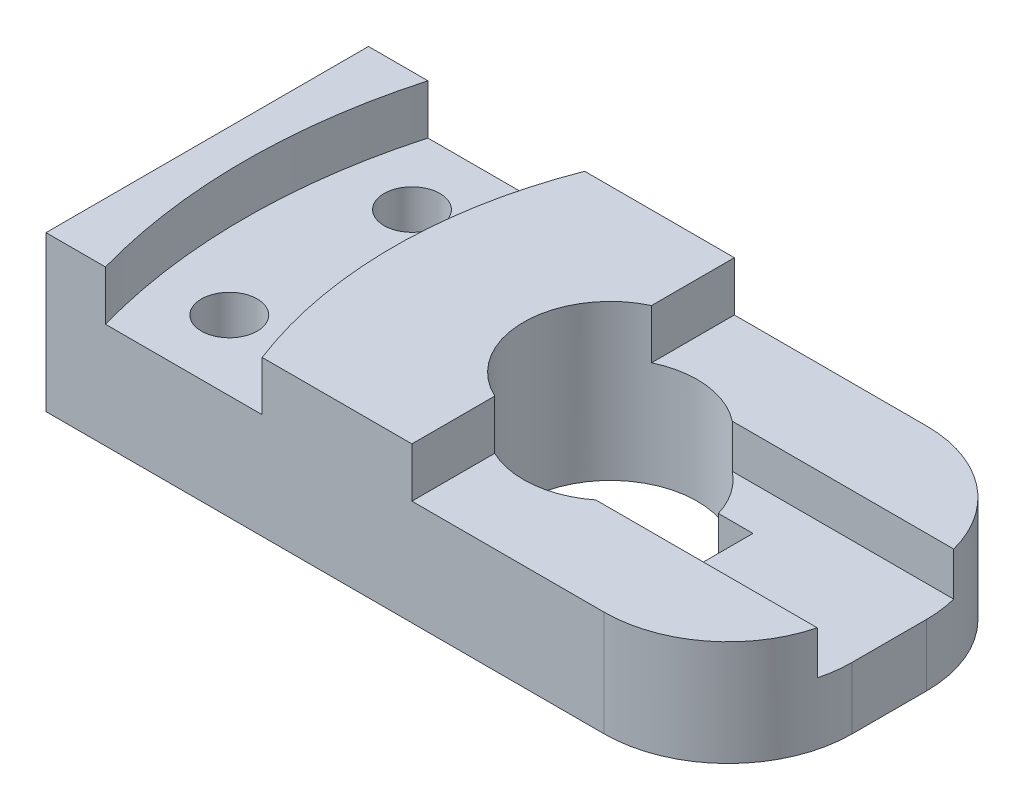
ISO-10303-21;
HEADER;
FILE_DESCRIPTION(('STEP AP214'),'2;1');
FILE_NAME('part.step','',(''),(''),'','','');
FILE_SCHEMA(('AUTOMOTIVE_DESIGN { 1 0 10303 214 1 1 1 1 }'));
ENDSEC;
DATA;
#1=APPLICATION_CONTEXT('core data for automotive mechanical design processes');
#2=APPLICATION_PROTOCOL_DEFINITION('international standard','automotive_design',2000,#1);
#3=PRODUCT_CONTEXT('',#1,'mechanical');
#4=PRODUCT('Part','Part','',(#3));
#5=PRODUCT_RELATED_PRODUCT_CATEGORY('part','',(#4));
#6=PRODUCT_DEFINITION_FORMATION('','',#4);
#7=PRODUCT_DEFINITION_CONTEXT('part definition',#1,'design');
#8=PRODUCT_DEFINITION('design','',#6,#7);
#9=PRODUCT_DEFINITION_SHAPE('','',#8);
#10=(LENGTH_UNIT() NAMED_UNIT(*) SI_UNIT(.MILLI.,.METRE.));
#11=(NAMED_UNIT(*) PLANE_ANGLE_UNIT() SI_UNIT($,.RADIAN.));
#12=(NAMED_UNIT(*) SI_UNIT($,.STERADIAN.) SOLID_ANGLE_UNIT());
#13=UNCERTAINTY_MEASURE_WITH_UNIT(LENGTH_MEASURE(1.E-05),#10,'distance_accuracy_value','');
#14=(GEOMETRIC_REPRESENTATION_CONTEXT(3) GLOBAL_UNCERTAINTY_ASSIGNED_CONTEXT((#13)) GLOBAL_UNIT_ASSIGNED_CONTEXT((#10,
#11,#12)) REPRESENTATION_CONTEXT('',''));
#15=CARTESIAN_POINT('',(0.,0.,0.));
#16=DIRECTION('',(0.,0.,1.));
#17=DIRECTION('',(1.,0.,0.));
#18=AXIS2_PLACEMENT_3D('',#15,#16,#17);
#19=CARTESIAN_POINT('',(0.,17.,-11.));
#20=DIRECTION('',(0.,0.,-1.));
#21=DIRECTION('',(-1.,0.,0.));
#22=AXIS2_PLACEMENT_3D('',#19,#20,#21);
#23=PLANE('',#22);
#24=DIRECTION('',(0.,-1.,0.));
#25=VECTOR('',#24,1.);
#26=CARTESIAN_POINT('',(73.6602540378444,17.,-11.));
#27=LINE('',#26,#25);
#28=CARTESIAN_POINT('',(73.6602540378444,17.,-11.));
#29=VERTEX_POINT('',#28);
#30=CARTESIAN_POINT('',(73.6602540378444,10.,-11.));
#31=VERTEX_POINT('',#30);
#32=EDGE_CURVE('E334',#29,#31,#27,.T.);
#33=ORIENTED_EDGE('',*,*,#32,.T.);
#34=DIRECTION('',(1.,0.,0.));
#35=VECTOR('',#34,1.);
#36=CARTESIAN_POINT('',(0.,10.,-11.));
#37=LINE('',#36,#35);
#38=CARTESIAN_POINT('',(109.364916731037,10.,-11.));
#39=VERTEX_POINT('',#38);
#40=EDGE_CURVE('E195',#31,#39,#37,.T.);
#41=ORIENTED_EDGE('',*,*,#40,.T.);
#42=DIRECTION('',(0.,-1.,0.));
#43=VECTOR('',#42,1.);
#44=CARTESIAN_POINT('',(109.364916731037,17.,-11.));
#45=LINE('',#44,#43);
#46=CARTESIAN_POINT('',(109.364916731037,17.,-11.));
#47=VERTEX_POINT('',#46);
#48=EDGE_CURVE('E11',#47,#39,#45,.T.);
#49=ORIENTED_EDGE('',*,*,#48,.F.);
#50=DIRECTION('',(1.,0.,0.));
#51=VECTOR('',#50,1.);
#52=CARTESIAN_POINT('',(0.,17.,-11.));
#53=LINE('',#52,#51);
#54=EDGE_CURVE('E318',#29,#47,#53,.T.);
#55=ORIENTED_EDGE('',*,*,#54,.F.);
#56=EDGE_LOOP('',(#33,#41,#49,#55));
#57=FACE_BOUND('',#56,.T.);
#58=ADVANCED_FACE('F39',(#57),#23,.F.);
#59=CARTESIAN_POINT('',(90.,17.,-6.));
#60=DIRECTION('',(0.,-1.,0.));
#61=DIRECTION('',(0.,0.,-1.));
#62=AXIS2_PLACEMENT_3D('',#59,#60,#61);
#63=CYLINDRICAL_SURFACE('',#62,20.);
#64=CARTESIAN_POINT('',(90.,0.,-6.));
#65=DIRECTION('',(0.,1.,0.));
#66=DIRECTION('',(0.,0.,1.));
#67=AXIS2_PLACEMENT_3D('',#64,#65,#66);
#68=CIRCLE('',#67,20.);
#69=CARTESIAN_POINT('',(110.,0.,-5.99999999999986));
#70=VERTEX_POINT('',#69);
#71=CARTESIAN_POINT('',(89.9999999999999,0.,-26.));
#72=VERTEX_POINT('',#71);
#73=EDGE_CURVE('E320',#70,#72,#68,.T.);
#74=ORIENTED_EDGE('',*,*,#73,.T.);
#75=DIRECTION('',(0.,-1.,0.));
#76=VECTOR('',#75,1.);
#77=CARTESIAN_POINT('',(89.9999999999999,17.,-26.));
#78=LINE('',#77,#76);
#79=CARTESIAN_POINT('',(89.9999999999999,17.,-26.));
#80=VERTEX_POINT('',#79);
#81=EDGE_CURVE('E46',#80,#72,#78,.T.);
#82=ORIENTED_EDGE('',*,*,#81,.F.);
#83=CARTESIAN_POINT('',(90.,17.,-6.));
#84=DIRECTION('',(0.,1.,0.));
#85=DIRECTION('',(0.,0.,1.));
#86=AXIS2_PLACEMENT_3D('',#83,#84,#85);
#87=CIRCLE('',#86,20.);
#88=EDGE_CURVE('E321',#47,#80,#87,.T.);
#89=ORIENTED_EDGE('',*,*,#88,.F.);
#90=ORIENTED_EDGE('',*,*,#48,.T.);
#91=CARTESIAN_POINT('',(90.,10.,-6.));
#92=DIRECTION('',(0.,1.,0.));
#93=DIRECTION('',(0.,0.,1.));
#94=AXIS2_PLACEMENT_3D('',#91,#92,#93);
#95=CIRCLE('',#94,20.);
#96=CARTESIAN_POINT('',(110.,10.,-5.99999999999986));
#97=VERTEX_POINT('',#96);
#98=EDGE_CURVE('E52',#97,#39,#95,.T.);
#99=ORIENTED_EDGE('',*,*,#98,.F.);
#100=DIRECTION('',(0.,-1.,0.));
#101=VECTOR('',#100,1.);
#102=CARTESIAN_POINT('',(110.,10.,-5.99999999999986));
#103=LINE('',#102,#101);
#104=EDGE_CURVE('E186',#97,#70,#103,.T.);
#105=ORIENTED_EDGE('',*,*,#104,.T.);
#106=EDGE_LOOP('',(#74,#82,#89,#90,#99,#105));
#107=FACE_BOUND('',#106,.T.);
#108=ADVANCED_FACE('F190',(#107),#63,.T.);
#109=CARTESIAN_POINT('',(0.,17.,-26.));
#110=DIRECTION('',(0.,0.,-1.));
#111=DIRECTION('',(-1.,0.,0.));
#112=AXIS2_PLACEMENT_3D('',#109,#110,#111);
#113=PLANE('',#112);
#114=DIRECTION('',(1.,0.,0.));
#115=VECTOR('',#114,1.);
#116=CARTESIAN_POINT('',(0.,0.,-26.));
#117=LINE('',#116,#115);
#118=CARTESIAN_POINT('',(0.,0.,-26.));
#119=VERTEX_POINT('',#118);
#120=EDGE_CURVE('E333',#119,#72,#117,.T.);
#121=ORIENTED_EDGE('',*,*,#120,.F.);
#122=DIRECTION('',(0.,-1.,0.));
#123=VECTOR('',#122,1.);
#124=CARTESIAN_POINT('',(0.,25.,-26.));
#125=LINE('',#124,#123);
#126=CARTESIAN_POINT('',(0.,25.,-26.));
#127=VERTEX_POINT('',#126);
#128=EDGE_CURVE('E235',#127,#119,#125,.T.);
#129=ORIENTED_EDGE('',*,*,#128,.F.);
#130=DIRECTION('',(1.,0.,0.));
#131=VECTOR('',#130,1.);
#132=CARTESIAN_POINT('',(0.,25.,-26.));
#133=LINE('',#132,#131);
#134=CARTESIAN_POINT('',(9.58787958281661,25.,-26.));
#135=VERTEX_POINT('',#134);
#136=EDGE_CURVE('E219',#127,#135,#133,.T.);
#137=ORIENTED_EDGE('',*,*,#136,.T.);
#138=DIRECTION('',(0.,-1.,0.));
#139=VECTOR('',#138,1.);
#140=CARTESIAN_POINT('',(9.58787958281661,25.,-26.));
#141=LINE('',#140,#139);
#142=CARTESIAN_POINT('',(9.58787958281661,17.,-26.));
#143=VERTEX_POINT('',#142);
#144=EDGE_CURVE('E234',#135,#143,#141,.T.);
#145=ORIENTED_EDGE('',*,*,#144,.T.);
#146=DIRECTION('',(1.,0.,0.));
#147=VECTOR('',#146,1.);
#148=CARTESIAN_POINT('',(0.,17.,-26.));
#149=LINE('',#148,#147);
#150=CARTESIAN_POINT('',(34.8583586736219,17.,-26.));
#151=VERTEX_POINT('',#150);
#152=EDGE_CURVE('E246',#143,#151,#149,.T.);
#153=ORIENTED_EDGE('',*,*,#152,.T.);
#154=DIRECTION('',(0.,-1.,0.));
#155=VECTOR('',#154,1.);
#156=CARTESIAN_POINT('',(34.8583586736219,25.,-26.));
#157=LINE('',#156,#155);
#158=CARTESIAN_POINT('',(34.8583586736219,25.,-26.));
#159=VERTEX_POINT('',#158);
#160=EDGE_CURVE('E310',#159,#151,#157,.T.);
#161=ORIENTED_EDGE('',*,*,#160,.F.);
#162=DIRECTION('',(1.,0.,0.));
#163=VECTOR('',#162,1.);
#164=CARTESIAN_POINT('',(0.,25.,-26.));
#165=LINE('',#164,#163);
#166=CARTESIAN_POINT('',(59.,25.,-26.));
#167=VERTEX_POINT('',#166);
#168=EDGE_CURVE('E289',#159,#167,#165,.T.);
#169=ORIENTED_EDGE('',*,*,#168,.T.);
#170=DIRECTION('',(0.,-1.,0.));
#171=VECTOR('',#170,1.);
#172=CARTESIAN_POINT('',(59.,25.,-26.));
#173=LINE('',#172,#171);
#174=CARTESIAN_POINT('',(59.,17.,-26.));
#175=VERTEX_POINT('',#174);
#176=EDGE_CURVE('E315',#167,#175,#173,.T.);
#177=ORIENTED_EDGE('',*,*,#176,.T.);
#178=DIRECTION('',(1.,0.,0.));
#179=VECTOR('',#178,1.);
#180=CARTESIAN_POINT('',(0.,17.,-26.));
#181=LINE('',#180,#179);
#182=EDGE_CURVE('E322',#175,#80,#181,.T.);
#183=ORIENTED_EDGE('',*,*,#182,.T.);
#184=ORIENTED_EDGE('',*,*,#81,.T.);
#185=EDGE_LOOP('',(#121,#129,#137,#145,#153,#161,#169,#177,#183,#184));
#186=FACE_BOUND('',#185,.T.);
#187=ADVANCED_FACE('F345',(#186),#113,.T.);
#188=CARTESIAN_POINT('',(65.,17.,0.));
#189=DIRECTION('',(0.,-1.,0.));
#190=DIRECTION('',(0.,0.,-1.));
#191=AXIS2_PLACEMENT_3D('',#188,#189,#190);
#192=CYLINDRICAL_SURFACE('',#191,14.);
#193=CARTESIAN_POINT('',(65.,0.,0.));
#194=DIRECTION('',(0.,1.,0.));
#195=DIRECTION('',(0.,0.,1.));
#196=AXIS2_PLACEMENT_3D('',#193,#194,#195);
#197=CIRCLE('',#196,14.);
#198=CARTESIAN_POINT('',(78.4164078649988,0.,-4.));
#199=VERTEX_POINT('',#198);
#200=CARTESIAN_POINT('',(78.4164078649988,0.,4.));
#201=VERTEX_POINT('',#200);
#202=EDGE_CURVE('E325',#199,#201,#197,.T.);
#203=ORIENTED_EDGE('',*,*,#202,.F.);
#204=DIRECTION('',(0.,-1.,0.));
#205=VECTOR('',#204,1.);
#206=CARTESIAN_POINT('',(78.4164078649988,10.,-4.));
#207=LINE('',#206,#205);
#208=CARTESIAN_POINT('',(78.4164078649988,10.,-4.));
#209=VERTEX_POINT('',#208);
#210=EDGE_CURVE('E208',#209,#199,#207,.T.);
#211=ORIENTED_EDGE('',*,*,#210,.F.);
#212=CARTESIAN_POINT('',(65.,10.,0.));
#213=DIRECTION('',(0.,1.,0.));
#214=DIRECTION('',(0.,0.,1.));
#215=AXIS2_PLACEMENT_3D('',#212,#213,#214);
#216=CIRCLE('',#215,14.);
#217=EDGE_CURVE('E389',#209,#31,#216,.T.);
#218=ORIENTED_EDGE('',*,*,#217,.T.);
#219=ORIENTED_EDGE('',*,*,#32,.F.);
#220=CARTESIAN_POINT('',(65.,17.,0.));
#221=DIRECTION('',(0.,1.,0.));
#222=DIRECTION('',(0.,0.,1.));
#223=AXIS2_PLACEMENT_3D('',#220,#221,#222);
#224=CIRCLE('',#223,14.);
#225=CARTESIAN_POINT('',(59.,17.,-12.6491106406735));
#226=VERTEX_POINT('',#225);
#227=EDGE_CURVE('E329',#29,#226,#224,.T.);
#228=ORIENTED_EDGE('',*,*,#227,.T.);
#229=DIRECTION('',(0.,-1.,0.));
#230=VECTOR('',#229,1.);
#231=CARTESIAN_POINT('',(59.,25.,-12.6491106406735));
#232=LINE('',#231,#230);
#233=CARTESIAN_POINT('',(59.,25.,-12.6491106406735));
#234=VERTEX_POINT('',#233);
#235=EDGE_CURVE('E312',#234,#226,#232,.T.);
#236=ORIENTED_EDGE('',*,*,#235,.F.);
#237=CARTESIAN_POINT('',(65.,25.,0.));
#238=DIRECTION('',(0.,1.,0.));
#239=DIRECTION('',(0.,0.,1.));
#240=AXIS2_PLACEMENT_3D('',#237,#238,#239);
#241=CIRCLE('',#240,14.);
#242=CARTESIAN_POINT('',(59.,25.,12.6491106406735));
#243=VERTEX_POINT('',#242);
#244=EDGE_CURVE('E281',#234,#243,#241,.T.);
#245=ORIENTED_EDGE('',*,*,#244,.T.);
#246=DIRECTION('',(0.,-1.,0.));
#247=VECTOR('',#246,1.);
#248=CARTESIAN_POINT('',(59.,25.,12.6491106406735));
#249=LINE('',#248,#247);
#250=CARTESIAN_POINT('',(59.,17.,12.6491106406735));
#251=VERTEX_POINT('',#250);
#252=EDGE_CURVE('E298',#243,#251,#249,.T.);
#253=ORIENTED_EDGE('',*,*,#252,.T.);
#254=CARTESIAN_POINT('',(65.,17.,0.));
#255=DIRECTION('',(0.,1.,0.));
#256=DIRECTION('',(0.,0.,1.));
#257=AXIS2_PLACEMENT_3D('',#254,#255,#256);
#258=CIRCLE('',#257,14.);
#259=CARTESIAN_POINT('',(73.6602540378444,17.,11.));
#260=VERTEX_POINT('',#259);
#261=EDGE_CURVE('E267',#251,#260,#258,.T.);
#262=ORIENTED_EDGE('',*,*,#261,.T.);
#263=DIRECTION('',(0.,-1.,0.));
#264=VECTOR('',#263,1.);
#265=CARTESIAN_POINT('',(73.6602540378444,17.,11.));
#266=LINE('',#265,#264);
#267=CARTESIAN_POINT('',(73.6602540378444,10.,11.));
#268=VERTEX_POINT('',#267);
#269=EDGE_CURVE('E274',#260,#268,#266,.T.);
#270=ORIENTED_EDGE('',*,*,#269,.T.);
#271=CARTESIAN_POINT('',(78.4164078649988,10.,4.));
#272=VERTEX_POINT('',#271);
#273=EDGE_CURVE('E394',#268,#272,#216,.T.);
#274=ORIENTED_EDGE('',*,*,#273,.T.);
#275=DIRECTION('',(0.,-1.,0.));
#276=VECTOR('',#275,1.);
#277=CARTESIAN_POINT('',(78.4164078649988,10.,4.));
#278=LINE('',#277,#276);
#279=EDGE_CURVE('E413',#272,#201,#278,.T.);
#280=ORIENTED_EDGE('',*,*,#279,.T.);
#281=EDGE_LOOP('',(#203,#211,#218,#219,#228,#236,#245,#253,#262,#270,#274,#280));
#282=FACE_BOUND('',#281,.T.);
#283=ADVANCED_FACE('F383',(#282),#192,.F.);
#284=CARTESIAN_POINT('',(0.,17.,0.));
#285=DIRECTION('',(0.,1.,0.));
#286=DIRECTION('',(0.,0.,1.));
#287=AXIS2_PLACEMENT_3D('',#284,#285,#286);
#288=PLANE('',#287);
#289=ORIENTED_EDGE('',*,*,#54,.T.);
#290=ORIENTED_EDGE('',*,*,#88,.T.);
#291=ORIENTED_EDGE('',*,*,#182,.F.);
#292=DIRECTION('',(0.,0.,1.));
#293=VECTOR('',#292,1.);
#294=CARTESIAN_POINT('',(59.,17.,0.));
#295=LINE('',#294,#293);
#296=EDGE_CURVE('E330',#175,#226,#295,.T.);
#297=ORIENTED_EDGE('',*,*,#296,.T.);
#298=ORIENTED_EDGE('',*,*,#227,.F.);
#299=EDGE_LOOP('',(#289,#290,#291,#297,#298));
#300=FACE_BOUND('',#299,.T.);
#301=ADVANCED_FACE('F385',(#300),#288,.T.);
#302=CARTESIAN_POINT('',(0.,0.,0.));
#303=DIRECTION('',(0.,1.,0.));
#304=DIRECTION('',(0.,0.,1.));
#305=AXIS2_PLACEMENT_3D('',#302,#303,#304);
#306=PLANE('',#305);
#307=ORIENTED_EDGE('',*,*,#73,.F.);
#308=DIRECTION('',(0.,0.,-1.));
#309=VECTOR('',#308,1.);
#310=CARTESIAN_POINT('',(110.,0.,0.));
#311=LINE('',#310,#309);
#312=CARTESIAN_POINT('',(110.,0.,5.99999999999986));
#313=VERTEX_POINT('',#312);
#314=EDGE_CURVE('E206',#313,#70,#311,.T.);
#315=ORIENTED_EDGE('',*,*,#314,.F.);
#316=CARTESIAN_POINT('',(90.,0.,6.));
#317=DIRECTION('',(0.,1.,0.));
#318=DIRECTION('',(0.,0.,1.));
#319=AXIS2_PLACEMENT_3D('',#316,#317,#318);
#320=CIRCLE('',#319,20.);
#321=CARTESIAN_POINT('',(89.9999999999999,0.,26.));
#322=VERTEX_POINT('',#321);
#323=EDGE_CURVE('E258',#322,#313,#320,.T.);
#324=ORIENTED_EDGE('',*,*,#323,.F.);
#325=DIRECTION('',(1.,0.,0.));
#326=VECTOR('',#325,1.);
#327=CARTESIAN_POINT('',(0.,0.,26.));
#328=LINE('',#327,#326);
#329=CARTESIAN_POINT('',(0.,0.,26.));
#330=VERTEX_POINT('',#329);
#331=EDGE_CURVE('E284',#330,#322,#328,.T.);
#332=ORIENTED_EDGE('',*,*,#331,.F.);
#333=DIRECTION('',(0.,0.,1.));
#334=VECTOR('',#333,1.);
#335=CARTESIAN_POINT('',(0.,0.,0.));
#336=LINE('',#335,#334);
#337=EDGE_CURVE('E210',#119,#330,#336,.T.);
#338=ORIENTED_EDGE('',*,*,#337,.F.);
#339=ORIENTED_EDGE('',*,*,#120,.T.);
#340=EDGE_LOOP('',(#307,#315,#324,#332,#338,#339));
#341=FACE_BOUND('',#340,.T.);
#342=DIRECTION('',(1.,0.,0.));
#343=VECTOR('',#342,1.);
#344=CARTESIAN_POINT('',(0.,0.,-4.));
#345=LINE('',#344,#343);
#346=CARTESIAN_POINT('',(84.,0.,-4.));
#347=VERTEX_POINT('',#346);
#348=EDGE_CURVE('E403',#199,#347,#345,.T.);
#349=ORIENTED_EDGE('',*,*,#348,.F.);
#350=ORIENTED_EDGE('',*,*,#202,.T.);
#351=DIRECTION('',(1.,0.,0.));
#352=VECTOR('',#351,1.);
#353=CARTESIAN_POINT('',(0.,0.,4.));
#354=LINE('',#353,#352);
#355=CARTESIAN_POINT('',(84.,0.,4.));
#356=VERTEX_POINT('',#355);
#357=EDGE_CURVE('E205',#201,#356,#354,.T.);
#358=ORIENTED_EDGE('',*,*,#357,.T.);
#359=DIRECTION('',(0.,0.,1.));
#360=VECTOR('',#359,1.);
#361=CARTESIAN_POINT('',(84.,0.,0.));
#362=LINE('',#361,#360);
#363=EDGE_CURVE('E410',#347,#356,#362,.T.);
#364=ORIENTED_EDGE('',*,*,#363,.F.);
#365=EDGE_LOOP('',(#349,#350,#358,#364));
#366=FACE_BOUND('',#365,.T.);
#367=CARTESIAN_POINT('',(18.2858491223179,0.,14.7289151952437));
#368=DIRECTION('',(0.,1.,0.));
#369=DIRECTION('',(0.,0.,1.));
#370=AXIS2_PLACEMENT_3D('',#367,#368,#369);
#371=CIRCLE('',#370,4.5);
#372=CARTESIAN_POINT('',(18.2858491223179,0.,19.2289151952437));
#373=VERTEX_POINT('',#372);
#374=EDGE_CURVE('E236',#373,#373,#371,.T.);
#375=ORIENTED_EDGE('',*,*,#374,.T.);
#376=EDGE_LOOP('',(#375));
#377=FACE_BOUND('',#376,.T.);
#378=CARTESIAN_POINT('',(18.2858491223178,0.,-14.728915195243));
#379=DIRECTION('',(0.,1.,0.));
#380=DIRECTION('',(0.,0.,1.));
#381=AXIS2_PLACEMENT_3D('',#378,#379,#380);
#382=CIRCLE('',#381,4.5);
#383=CARTESIAN_POINT('',(18.2858491223178,0.,-10.228915195243));
#384=VERTEX_POINT('',#383);
#385=EDGE_CURVE('E244',#384,#384,#382,.T.);
#386=ORIENTED_EDGE('',*,*,#385,.T.);
#387=EDGE_LOOP('',(#386));
#388=FACE_BOUND('',#387,.T.);
#389=ADVANCED_FACE('F347',(#341,#366,#377,#388),#306,.F.);
#390=CARTESIAN_POINT('',(59.,25.,0.));
#391=DIRECTION('',(1.,0.,0.));
#392=DIRECTION('',(0.,0.,-1.));
#393=AXIS2_PLACEMENT_3D('',#390,#391,#392);
#394=PLANE('',#393);
#395=ORIENTED_EDGE('',*,*,#296,.F.);
#396=ORIENTED_EDGE('',*,*,#176,.F.);
#397=DIRECTION('',(0.,0.,1.));
#398=VECTOR('',#397,1.);
#399=CARTESIAN_POINT('',(59.,25.,0.));
#400=LINE('',#399,#398);
#401=EDGE_CURVE('E290',#167,#234,#400,.T.);
#402=ORIENTED_EDGE('',*,*,#401,.T.);
#403=ORIENTED_EDGE('',*,*,#235,.T.);
#404=EDGE_LOOP('',(#395,#396,#402,#403));
#405=FACE_BOUND('',#404,.T.);
#406=ADVANCED_FACE('F377',(#405),#394,.T.);
#407=CARTESIAN_POINT('',(102.,25.,0.));
#408=DIRECTION('',(0.,-1.,0.));
#409=DIRECTION('',(0.,0.,-1.));
#410=AXIS2_PLACEMENT_3D('',#407,#408,#409);
#411=CYLINDRICAL_SURFACE('',#410,72.);
#412=ORIENTED_EDGE('',*,*,#160,.T.);
#413=CARTESIAN_POINT('',(102.,17.,0.));
#414=DIRECTION('',(0.,1.,0.));
#415=DIRECTION('',(0.,0.,1.));
#416=AXIS2_PLACEMENT_3D('',#413,#414,#415);
#417=CIRCLE('',#416,72.);
#418=CARTESIAN_POINT('',(34.8583586736219,17.,26.));
#419=VERTEX_POINT('',#418);
#420=EDGE_CURVE('E251',#151,#419,#417,.T.);
#421=ORIENTED_EDGE('',*,*,#420,.T.);
#422=DIRECTION('',(0.,-1.,0.));
#423=VECTOR('',#422,1.);
#424=CARTESIAN_POINT('',(34.8583586736219,25.,26.));
#425=LINE('',#424,#423);
#426=CARTESIAN_POINT('',(34.8583586736219,25.,26.));
#427=VERTEX_POINT('',#426);
#428=EDGE_CURVE('E308',#427,#419,#425,.T.);
#429=ORIENTED_EDGE('',*,*,#428,.F.);
#430=CARTESIAN_POINT('',(102.,25.,0.));
#431=DIRECTION('',(0.,1.,0.));
#432=DIRECTION('',(0.,0.,1.));
#433=AXIS2_PLACEMENT_3D('',#430,#431,#432);
#434=CIRCLE('',#433,72.);
#435=EDGE_CURVE('E291',#159,#427,#434,.T.);
#436=ORIENTED_EDGE('',*,*,#435,.F.);
#437=EDGE_LOOP('',(#412,#421,#429,#436));
#438=FACE_BOUND('',#437,.T.);
#439=ADVANCED_FACE('F371',(#438),#411,.T.);
#440=CARTESIAN_POINT('',(0.,25.,26.));
#441=DIRECTION('',(0.,0.,-1.));
#442=DIRECTION('',(-1.,0.,0.));
#443=AXIS2_PLACEMENT_3D('',#440,#441,#442);
#444=PLANE('',#443);
#445=ORIENTED_EDGE('',*,*,#331,.T.);
#446=DIRECTION('',(0.,-1.,0.));
#447=VECTOR('',#446,1.);
#448=CARTESIAN_POINT('',(89.9999999999999,17.,26.));
#449=LINE('',#448,#447);
#450=CARTESIAN_POINT('',(89.9999999999999,17.,26.));
#451=VERTEX_POINT('',#450);
#452=EDGE_CURVE('E278',#451,#322,#449,.T.);
#453=ORIENTED_EDGE('',*,*,#452,.F.);
#454=DIRECTION('',(1.,0.,0.));
#455=VECTOR('',#454,1.);
#456=CARTESIAN_POINT('',(0.,17.,26.));
#457=LINE('',#456,#455);
#458=CARTESIAN_POINT('',(59.,17.,26.));
#459=VERTEX_POINT('',#458);
#460=EDGE_CURVE('E261',#459,#451,#457,.T.);
#461=ORIENTED_EDGE('',*,*,#460,.F.);
#462=DIRECTION('',(0.,-1.,0.));
#463=VECTOR('',#462,1.);
#464=CARTESIAN_POINT('',(59.,25.,26.));
#465=LINE('',#464,#463);
#466=CARTESIAN_POINT('',(59.,25.,26.));
#467=VERTEX_POINT('',#466);
#468=EDGE_CURVE('E302',#467,#459,#465,.T.);
#469=ORIENTED_EDGE('',*,*,#468,.F.);
#470=DIRECTION('',(1.,0.,0.));
#471=VECTOR('',#470,1.);
#472=CARTESIAN_POINT('',(0.,25.,26.));
#473=LINE('',#472,#471);
#474=EDGE_CURVE('E293',#427,#467,#473,.T.);
#475=ORIENTED_EDGE('',*,*,#474,.F.);
#476=ORIENTED_EDGE('',*,*,#428,.T.);
#477=DIRECTION('',(1.,0.,0.));
#478=VECTOR('',#477,1.);
#479=CARTESIAN_POINT('',(0.,17.,26.));
#480=LINE('',#479,#478);
#481=CARTESIAN_POINT('',(9.58787958281661,17.,26.));
#482=VERTEX_POINT('',#481);
#483=EDGE_CURVE('E253',#482,#419,#480,.T.);
#484=ORIENTED_EDGE('',*,*,#483,.F.);
#485=DIRECTION('',(0.,-1.,0.));
#486=VECTOR('',#485,1.);
#487=CARTESIAN_POINT('',(9.58787958281661,25.,26.));
#488=LINE('',#487,#486);
#489=CARTESIAN_POINT('',(9.58787958281661,25.,26.));
#490=VERTEX_POINT('',#489);
#491=EDGE_CURVE('E227',#490,#482,#488,.T.);
#492=ORIENTED_EDGE('',*,*,#491,.F.);
#493=DIRECTION('',(1.,0.,0.));
#494=VECTOR('',#493,1.);
#495=CARTESIAN_POINT('',(0.,25.,26.));
#496=LINE('',#495,#494);
#497=CARTESIAN_POINT('',(0.,25.,26.));
#498=VERTEX_POINT('',#497);
#499=EDGE_CURVE('E223',#498,#490,#496,.T.);
#500=ORIENTED_EDGE('',*,*,#499,.F.);
#501=DIRECTION('',(0.,-1.,0.));
#502=VECTOR('',#501,1.);
#503=CARTESIAN_POINT('',(0.,25.,26.));
#504=LINE('',#503,#502);
#505=EDGE_CURVE('E226',#498,#330,#504,.T.);
#506=ORIENTED_EDGE('',*,*,#505,.T.);
#507=EDGE_LOOP('',(#445,#453,#461,#469,#475,#476,#484,#492,#500,#506));
#508=FACE_BOUND('',#507,.T.);
#509=ADVANCED_FACE('F353',(#508),#444,.F.);
#510=CARTESIAN_POINT('',(59.,25.,0.));
#511=DIRECTION('',(1.,0.,0.));
#512=DIRECTION('',(0.,0.,-1.));
#513=AXIS2_PLACEMENT_3D('',#510,#511,#512);
#514=PLANE('',#513);
#515=DIRECTION('',(0.,0.,1.));
#516=VECTOR('',#515,1.);
#517=CARTESIAN_POINT('',(59.,17.,0.));
#518=LINE('',#517,#516);
#519=EDGE_CURVE('E275',#251,#459,#518,.T.);
#520=ORIENTED_EDGE('',*,*,#519,.F.);
#521=ORIENTED_EDGE('',*,*,#252,.F.);
#522=DIRECTION('',(0.,0.,1.));
#523=VECTOR('',#522,1.);
#524=CARTESIAN_POINT('',(59.,25.,0.));
#525=LINE('',#524,#523);
#526=EDGE_CURVE('E300',#243,#467,#525,.T.);
#527=ORIENTED_EDGE('',*,*,#526,.T.);
#528=ORIENTED_EDGE('',*,*,#468,.T.);
#529=EDGE_LOOP('',(#520,#521,#527,#528));
#530=FACE_BOUND('',#529,.T.);
#531=ADVANCED_FACE('F447',(#530),#514,.T.);
#532=CARTESIAN_POINT('',(0.,25.,0.));
#533=DIRECTION('',(0.,1.,0.));
#534=DIRECTION('',(0.,0.,1.));
#535=AXIS2_PLACEMENT_3D('',#532,#533,#534);
#536=PLANE('',#535);
#537=ORIENTED_EDGE('',*,*,#244,.F.);
#538=ORIENTED_EDGE('',*,*,#401,.F.);
#539=ORIENTED_EDGE('',*,*,#168,.F.);
#540=ORIENTED_EDGE('',*,*,#435,.T.);
#541=ORIENTED_EDGE('',*,*,#474,.T.);
#542=ORIENTED_EDGE('',*,*,#526,.F.);
#543=EDGE_LOOP('',(#537,#538,#539,#540,#541,#542));
#544=FACE_BOUND('',#543,.T.);
#545=ADVANCED_FACE('F376',(#544),#536,.T.);
#546=CARTESIAN_POINT('',(90.,17.,6.));
#547=DIRECTION('',(0.,-1.,0.));
#548=DIRECTION('',(0.,0.,-1.));
#549=AXIS2_PLACEMENT_3D('',#546,#547,#548);
#550=CYLINDRICAL_SURFACE('',#549,20.);
#551=ORIENTED_EDGE('',*,*,#323,.T.);
#552=DIRECTION('',(0.,-1.,0.));
#553=VECTOR('',#552,1.);
#554=CARTESIAN_POINT('',(110.,10.,5.99999999999986));
#555=LINE('',#554,#553);
#556=CARTESIAN_POINT('',(110.,10.,5.99999999999986));
#557=VERTEX_POINT('',#556);
#558=EDGE_CURVE('E401',#557,#313,#555,.T.);
#559=ORIENTED_EDGE('',*,*,#558,.F.);
#560=CARTESIAN_POINT('',(90.,10.,6.));
#561=DIRECTION('',(0.,1.,0.));
#562=DIRECTION('',(0.,0.,1.));
#563=AXIS2_PLACEMENT_3D('',#560,#561,#562);
#564=CIRCLE('',#563,20.);
#565=CARTESIAN_POINT('',(109.364916731037,10.,11.));
#566=VERTEX_POINT('',#565);
#567=EDGE_CURVE('E196',#566,#557,#564,.T.);
#568=ORIENTED_EDGE('',*,*,#567,.F.);
#569=DIRECTION('',(0.,-1.,0.));
#570=VECTOR('',#569,1.);
#571=CARTESIAN_POINT('',(109.364916731037,17.,11.));
#572=LINE('',#571,#570);
#573=CARTESIAN_POINT('',(109.364916731037,17.,11.));
#574=VERTEX_POINT('',#573);
#575=EDGE_CURVE('E279',#574,#566,#572,.T.);
#576=ORIENTED_EDGE('',*,*,#575,.F.);
#577=CARTESIAN_POINT('',(90.,17.,6.));
#578=DIRECTION('',(0.,1.,0.));
#579=DIRECTION('',(0.,0.,1.));
#580=AXIS2_PLACEMENT_3D('',#577,#578,#579);
#581=CIRCLE('',#580,20.);
#582=EDGE_CURVE('E262',#451,#574,#581,.T.);
#583=ORIENTED_EDGE('',*,*,#582,.F.);
#584=ORIENTED_EDGE('',*,*,#452,.T.);
#585=EDGE_LOOP('',(#551,#559,#568,#576,#583,#584));
#586=FACE_BOUND('',#585,.T.);
#587=ADVANCED_FACE('F445',(#586),#550,.T.);
#588=CARTESIAN_POINT('',(0.,17.,11.));
#589=DIRECTION('',(0.,0.,-1.));
#590=DIRECTION('',(-1.,0.,0.));
#591=AXIS2_PLACEMENT_3D('',#588,#589,#590);
#592=PLANE('',#591);
#593=DIRECTION('',(1.,0.,0.));
#594=VECTOR('',#593,1.);
#595=CARTESIAN_POINT('',(0.,10.,11.));
#596=LINE('',#595,#594);
#597=EDGE_CURVE('E62',#268,#566,#596,.T.);
#598=ORIENTED_EDGE('',*,*,#597,.F.);
#599=ORIENTED_EDGE('',*,*,#269,.F.);
#600=DIRECTION('',(1.,0.,0.));
#601=VECTOR('',#600,1.);
#602=CARTESIAN_POINT('',(0.,17.,11.));
#603=LINE('',#602,#601);
#604=EDGE_CURVE('E266',#260,#574,#603,.T.);
#605=ORIENTED_EDGE('',*,*,#604,.T.);
#606=ORIENTED_EDGE('',*,*,#575,.T.);
#607=EDGE_LOOP('',(#598,#599,#605,#606));
#608=FACE_BOUND('',#607,.T.);
#609=ADVANCED_FACE('F436',(#608),#592,.T.);
#610=CARTESIAN_POINT('',(0.,17.,0.));
#611=DIRECTION('',(0.,1.,0.));
#612=DIRECTION('',(0.,0.,1.));
#613=AXIS2_PLACEMENT_3D('',#610,#611,#612);
#614=PLANE('',#613);
#615=ORIENTED_EDGE('',*,*,#460,.T.);
#616=ORIENTED_EDGE('',*,*,#582,.T.);
#617=ORIENTED_EDGE('',*,*,#604,.F.);
#618=ORIENTED_EDGE('',*,*,#261,.F.);
#619=ORIENTED_EDGE('',*,*,#519,.T.);
#620=EDGE_LOOP('',(#615,#616,#617,#618,#619));
#621=FACE_BOUND('',#620,.T.);
#622=ADVANCED_FACE('F437',(#621),#614,.T.);
#623=CARTESIAN_POINT('',(18.2858491223178,17.,-14.728915195243));
#624=DIRECTION('',(0.,-1.,0.));
#625=DIRECTION('',(0.,0.,-1.));
#626=AXIS2_PLACEMENT_3D('',#623,#624,#625);
#627=CYLINDRICAL_SURFACE('',#626,4.5);
#628=CARTESIAN_POINT('',(18.2858491223178,17.,-14.728915195243));
#629=DIRECTION('',(0.,1.,0.));
#630=DIRECTION('',(0.,0.,1.));
#631=AXIS2_PLACEMENT_3D('',#628,#629,#630);
#632=CIRCLE('',#631,4.5);
#633=CARTESIAN_POINT('',(18.2858491223178,17.,-10.228915195243));
#634=VERTEX_POINT('',#633);
#635=EDGE_CURVE('E245',#634,#634,#632,.T.);
#636=ORIENTED_EDGE('',*,*,#635,.T.);
#637=EDGE_LOOP('',(#636));
#638=FACE_BOUND('',#637,.T.);
#639=ORIENTED_EDGE('',*,*,#385,.F.);
#640=EDGE_LOOP('',(#639));
#641=FACE_BOUND('',#640,.T.);
#642=ADVANCED_FACE('F606',(#638,#641),#627,.F.);
#643=CARTESIAN_POINT('',(18.2858491223179,17.,14.7289151952437));
#644=DIRECTION('',(0.,-1.,0.));
#645=DIRECTION('',(0.,0.,-1.));
#646=AXIS2_PLACEMENT_3D('',#643,#644,#645);
#647=CYLINDRICAL_SURFACE('',#646,4.5);
#648=CARTESIAN_POINT('',(18.2858491223179,17.,14.7289151952437));
#649=DIRECTION('',(0.,1.,0.));
#650=DIRECTION('',(0.,0.,1.));
#651=AXIS2_PLACEMENT_3D('',#648,#649,#650);
#652=CIRCLE('',#651,4.5);
#653=CARTESIAN_POINT('',(18.2858491223179,17.,19.2289151952437));
#654=VERTEX_POINT('',#653);
#655=EDGE_CURVE('E239',#654,#654,#652,.T.);
#656=ORIENTED_EDGE('',*,*,#655,.T.);
#657=EDGE_LOOP('',(#656));
#658=FACE_BOUND('',#657,.T.);
#659=ORIENTED_EDGE('',*,*,#374,.F.);
#660=EDGE_LOOP('',(#659));
#661=FACE_BOUND('',#660,.T.);
#662=ADVANCED_FACE('F610',(#658,#661),#647,.F.);
#663=CARTESIAN_POINT('',(0.,17.,0.));
#664=DIRECTION('',(0.,1.,0.));
#665=DIRECTION('',(0.,0.,1.));
#666=AXIS2_PLACEMENT_3D('',#663,#664,#665);
#667=PLANE('',#666);
#668=ORIENTED_EDGE('',*,*,#655,.F.);
#669=EDGE_LOOP('',(#668));
#670=FACE_BOUND('',#669,.T.);
#671=ORIENTED_EDGE('',*,*,#635,.F.);
#672=EDGE_LOOP('',(#671));
#673=FACE_BOUND('',#672,.T.);
#674=ORIENTED_EDGE('',*,*,#152,.F.);
#675=CARTESIAN_POINT('',(102.,17.,0.));
#676=DIRECTION('',(0.,1.,0.));
#677=DIRECTION('',(0.,0.,1.));
#678=AXIS2_PLACEMENT_3D('',#675,#676,#677);
#679=CIRCLE('',#678,96.);
#680=EDGE_CURVE('E248',#143,#482,#679,.T.);
#681=ORIENTED_EDGE('',*,*,#680,.T.);
#682=ORIENTED_EDGE('',*,*,#483,.T.);
#683=ORIENTED_EDGE('',*,*,#420,.F.);
#684=EDGE_LOOP('',(#674,#681,#682,#683));
#685=FACE_BOUND('',#684,.T.);
#686=ADVANCED_FACE('F370',(#670,#673,#685),#667,.T.);
#687=CARTESIAN_POINT('',(102.,25.,0.));
#688=DIRECTION('',(0.,-1.,0.));
#689=DIRECTION('',(0.,0.,-1.));
#690=AXIS2_PLACEMENT_3D('',#687,#688,#689);
#691=CYLINDRICAL_SURFACE('',#690,96.);
#692=ORIENTED_EDGE('',*,*,#680,.F.);
#693=ORIENTED_EDGE('',*,*,#144,.F.);
#694=CARTESIAN_POINT('',(102.,25.,0.));
#695=DIRECTION('',(0.,1.,0.));
#696=DIRECTION('',(0.,0.,1.));
#697=AXIS2_PLACEMENT_3D('',#694,#695,#696);
#698=CIRCLE('',#697,96.);
#699=EDGE_CURVE('E211',#135,#490,#698,.T.);
#700=ORIENTED_EDGE('',*,*,#699,.T.);
#701=ORIENTED_EDGE('',*,*,#491,.T.);
#702=EDGE_LOOP('',(#692,#693,#700,#701));
#703=FACE_BOUND('',#702,.T.);
#704=ADVANCED_FACE('F505',(#703),#691,.F.);
#705=CARTESIAN_POINT('',(0.,25.,0.));
#706=DIRECTION('',(1.,0.,0.));
#707=DIRECTION('',(0.,0.,-1.));
#708=AXIS2_PLACEMENT_3D('',#705,#706,#707);
#709=PLANE('',#708);
#710=ORIENTED_EDGE('',*,*,#337,.T.);
#711=ORIENTED_EDGE('',*,*,#505,.F.);
#712=DIRECTION('',(0.,0.,1.));
#713=VECTOR('',#712,1.);
#714=CARTESIAN_POINT('',(0.,25.,0.));
#715=LINE('',#714,#713);
#716=EDGE_CURVE('E224',#127,#498,#715,.T.);
#717=ORIENTED_EDGE('',*,*,#716,.F.);
#718=ORIENTED_EDGE('',*,*,#128,.T.);
#719=EDGE_LOOP('',(#710,#711,#717,#718));
#720=FACE_BOUND('',#719,.T.);
#721=ADVANCED_FACE('F352',(#720),#709,.F.);
#722=CARTESIAN_POINT('',(0.,25.,0.));
#723=DIRECTION('',(0.,1.,0.));
#724=DIRECTION('',(0.,0.,1.));
#725=AXIS2_PLACEMENT_3D('',#722,#723,#724);
#726=PLANE('',#725);
#727=ORIENTED_EDGE('',*,*,#699,.F.);
#728=ORIENTED_EDGE('',*,*,#136,.F.);
#729=ORIENTED_EDGE('',*,*,#716,.T.);
#730=ORIENTED_EDGE('',*,*,#499,.T.);
#731=EDGE_LOOP('',(#727,#728,#729,#730));
#732=FACE_BOUND('',#731,.T.);
#733=ADVANCED_FACE('F363',(#732),#726,.T.);
#734=CARTESIAN_POINT('',(110.,10.,0.));
#735=DIRECTION('',(-1.,0.,0.));
#736=DIRECTION('',(0.,0.,1.));
#737=AXIS2_PLACEMENT_3D('',#734,#735,#736);
#738=PLANE('',#737);
#739=ORIENTED_EDGE('',*,*,#314,.T.);
#740=ORIENTED_EDGE('',*,*,#104,.F.);
#741=DIRECTION('',(0.,0.,-1.));
#742=VECTOR('',#741,1.);
#743=CARTESIAN_POINT('',(110.,10.,0.));
#744=LINE('',#743,#742);
#745=EDGE_CURVE('E193',#557,#97,#744,.T.);
#746=ORIENTED_EDGE('',*,*,#745,.F.);
#747=ORIENTED_EDGE('',*,*,#558,.T.);
#748=EDGE_LOOP('',(#739,#740,#746,#747));
#749=FACE_BOUND('',#748,.T.);
#750=ADVANCED_FACE('F204',(#749),#738,.F.);
#751=CARTESIAN_POINT('',(0.,10.,-4.));
#752=DIRECTION('',(0.,0.,-1.));
#753=DIRECTION('',(-1.,0.,0.));
#754=AXIS2_PLACEMENT_3D('',#751,#752,#753);
#755=PLANE('',#754);
#756=ORIENTED_EDGE('',*,*,#348,.T.);
#757=DIRECTION('',(0.,-1.,0.));
#758=VECTOR('',#757,1.);
#759=CARTESIAN_POINT('',(84.,10.,-4.));
#760=LINE('',#759,#758);
#761=CARTESIAN_POINT('',(84.,10.,-4.));
#762=VERTEX_POINT('',#761);
#763=EDGE_CURVE('E212',#762,#347,#760,.T.);
#764=ORIENTED_EDGE('',*,*,#763,.F.);
#765=DIRECTION('',(1.,0.,0.));
#766=VECTOR('',#765,1.);
#767=CARTESIAN_POINT('',(0.,10.,-4.));
#768=LINE('',#767,#766);
#769=EDGE_CURVE('E392',#209,#762,#768,.T.);
#770=ORIENTED_EDGE('',*,*,#769,.F.);
#771=ORIENTED_EDGE('',*,*,#210,.T.);
#772=EDGE_LOOP('',(#756,#764,#770,#771));
#773=FACE_BOUND('',#772,.T.);
#774=ADVANCED_FACE('F568',(#773),#755,.F.);
#775=CARTESIAN_POINT('',(84.,10.,0.));
#776=DIRECTION('',(1.,0.,0.));
#777=DIRECTION('',(0.,0.,-1.));
#778=AXIS2_PLACEMENT_3D('',#775,#776,#777);
#779=PLANE('',#778);
#780=ORIENTED_EDGE('',*,*,#363,.T.);
#781=DIRECTION('',(0.,-1.,0.));
#782=VECTOR('',#781,1.);
#783=CARTESIAN_POINT('',(84.,10.,4.));
#784=LINE('',#783,#782);
#785=CARTESIAN_POINT('',(84.,10.,4.));
#786=VERTEX_POINT('',#785);
#787=EDGE_CURVE('E418',#786,#356,#784,.T.);
#788=ORIENTED_EDGE('',*,*,#787,.F.);
#789=DIRECTION('',(0.,0.,1.));
#790=VECTOR('',#789,1.);
#791=CARTESIAN_POINT('',(84.,10.,0.));
#792=LINE('',#791,#790);
#793=EDGE_CURVE('E396',#762,#786,#792,.T.);
#794=ORIENTED_EDGE('',*,*,#793,.F.);
#795=ORIENTED_EDGE('',*,*,#763,.T.);
#796=EDGE_LOOP('',(#780,#788,#794,#795));
#797=FACE_BOUND('',#796,.T.);
#798=ADVANCED_FACE('F425',(#797),#779,.F.);
#799=CARTESIAN_POINT('',(0.,10.,4.));
#800=DIRECTION('',(0.,0.,-1.));
#801=DIRECTION('',(-1.,0.,0.));
#802=AXIS2_PLACEMENT_3D('',#799,#800,#801);
#803=PLANE('',#802);
#804=ORIENTED_EDGE('',*,*,#357,.F.);
#805=ORIENTED_EDGE('',*,*,#279,.F.);
#806=DIRECTION('',(1.,0.,0.));
#807=VECTOR('',#806,1.);
#808=CARTESIAN_POINT('',(0.,10.,4.));
#809=LINE('',#808,#807);
#810=EDGE_CURVE('E398',#272,#786,#809,.T.);
#811=ORIENTED_EDGE('',*,*,#810,.T.);
#812=ORIENTED_EDGE('',*,*,#787,.T.);
#813=EDGE_LOOP('',(#804,#805,#811,#812));
#814=FACE_BOUND('',#813,.T.);
#815=ADVANCED_FACE('F429',(#814),#803,.T.);
#816=CARTESIAN_POINT('',(0.,10.,0.));
#817=DIRECTION('',(0.,1.,0.));
#818=DIRECTION('',(0.,0.,1.));
#819=AXIS2_PLACEMENT_3D('',#816,#817,#818);
#820=PLANE('',#819);
#821=ORIENTED_EDGE('',*,*,#745,.T.);
#822=ORIENTED_EDGE('',*,*,#98,.T.);
#823=ORIENTED_EDGE('',*,*,#40,.F.);
#824=ORIENTED_EDGE('',*,*,#217,.F.);
#825=ORIENTED_EDGE('',*,*,#769,.T.);
#826=ORIENTED_EDGE('',*,*,#793,.T.);
#827=ORIENTED_EDGE('',*,*,#810,.F.);
#828=ORIENTED_EDGE('',*,*,#273,.F.);
#829=ORIENTED_EDGE('',*,*,#597,.T.);
#830=ORIENTED_EDGE('',*,*,#567,.T.);
#831=EDGE_LOOP('',(#821,#822,#823,#824,#825,#826,#827,#828,#829,#830));
#832=FACE_BOUND('',#831,.T.);
#833=ADVANCED_FACE('F198',(#832),#820,.T.);
#834=CLOSED_SHELL('',(#58,#108,#187,#283,#301,#389,#406,#439,#509,#531,#545,#587,#609,#622,#642,
#662,#686,#704,#721,#733,#750,#774,#798,#815,#833));
#835=MANIFOLD_SOLID_BREP('B2',#834);
#836=ADVANCED_BREP_SHAPE_REPRESENTATION('',(#18,#835),#14);
#837=SHAPE_DEFINITION_REPRESENTATION(#9,#836);
ENDSEC;
END-ISO-10303-21;
